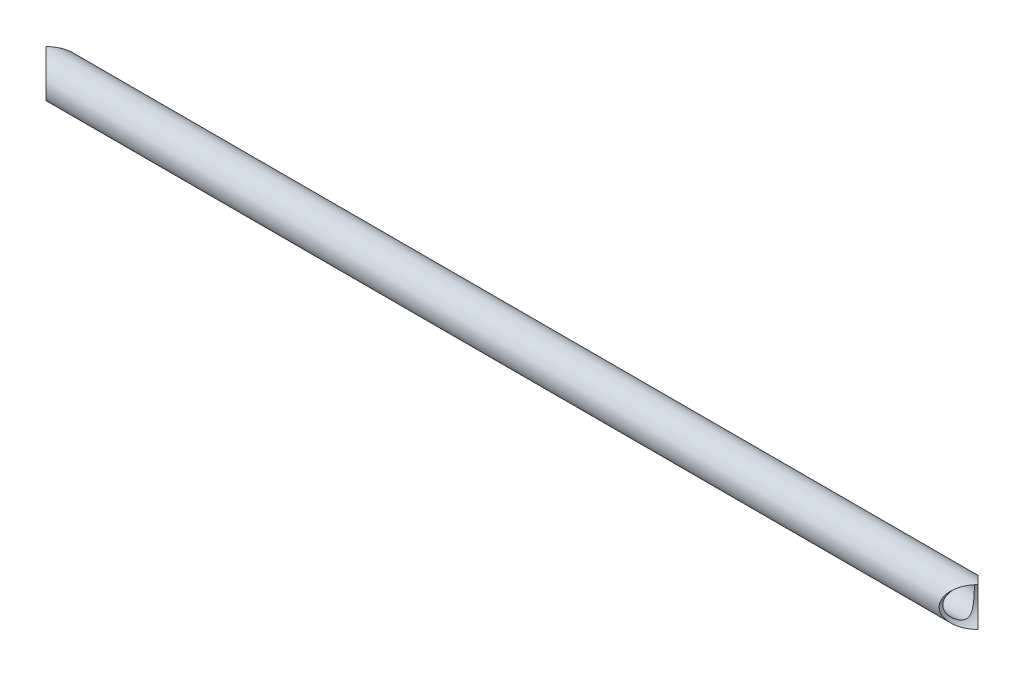
ISO-10303-21;
HEADER;
FILE_DESCRIPTION(('STEP AP214'),'2;1');
FILE_NAME('part.step','',(''),(''),'','','');
FILE_SCHEMA(('AUTOMOTIVE_DESIGN { 1 0 10303 214 1 1 1 1 }'));
ENDSEC;
DATA;
#1=APPLICATION_CONTEXT('core data for automotive mechanical design processes');
#2=APPLICATION_PROTOCOL_DEFINITION('international standard','automotive_design',2000,#1);
#3=PRODUCT_CONTEXT('',#1,'mechanical');
#4=PRODUCT('Part','Part','',(#3));
#5=PRODUCT_RELATED_PRODUCT_CATEGORY('part','',(#4));
#6=PRODUCT_DEFINITION_FORMATION('','',#4);
#7=PRODUCT_DEFINITION_CONTEXT('part definition',#1,'design');
#8=PRODUCT_DEFINITION('design','',#6,#7);
#9=PRODUCT_DEFINITION_SHAPE('','',#8);
#10=(LENGTH_UNIT() NAMED_UNIT(*) SI_UNIT(.MILLI.,.METRE.));
#11=(NAMED_UNIT(*) PLANE_ANGLE_UNIT() SI_UNIT($,.RADIAN.));
#12=(NAMED_UNIT(*) SI_UNIT($,.STERADIAN.) SOLID_ANGLE_UNIT());
#13=UNCERTAINTY_MEASURE_WITH_UNIT(LENGTH_MEASURE(1.E-05),#10,'distance_accuracy_value','');
#14=(GEOMETRIC_REPRESENTATION_CONTEXT(3) GLOBAL_UNCERTAINTY_ASSIGNED_CONTEXT((#13)) GLOBAL_UNIT_ASSIGNED_CONTEXT((#10,
#11,#12)) REPRESENTATION_CONTEXT('',''));
#15=CARTESIAN_POINT('',(0.,0.,0.));
#16=DIRECTION('',(0.,0.,1.));
#17=DIRECTION('',(1.,0.,0.));
#18=AXIS2_PLACEMENT_3D('',#15,#16,#17);
#19=CARTESIAN_POINT('',(473.575059000242,250.,150.));
#20=DIRECTION('',(1.,0.,0.));
#21=DIRECTION('',(0.,0.,-1.));
#22=AXIS2_PLACEMENT_3D('',#19,#20,#21);
#23=CYLINDRICAL_SURFACE('',#22,7.93750000000001);
#24=CARTESIAN_POINT('',(854.389836714472,250.,150.));
#25=DIRECTION('',(0.707106781186547,0.,0.707106781186547));
#26=DIRECTION('',(0.707106781186547,0.,-0.707106781186547));
#27=AXIS2_PLACEMENT_3D('',#24,#25,#26);
#28=ELLIPSE('',#27,11.2253201513364,7.93749999999999);
#29=CARTESIAN_POINT('',(854.389836714472,257.9375,150.));
#30=VERTEX_POINT('',#29);
#31=CARTESIAN_POINT('',(854.389836714472,242.0625,150.));
#32=VERTEX_POINT('',#31);
#33=EDGE_CURVE('E72',#30,#32,#28,.T.);
#34=ORIENTED_EDGE('',*,*,#33,.F.);
#35=CARTESIAN_POINT('',(854.389836714472,250.,150.));
#36=DIRECTION('',(0.707106781186547,0.,-0.707106781186547));
#37=DIRECTION('',(0.707106781186547,0.,0.707106781186547));
#38=AXIS2_PLACEMENT_3D('',#35,#36,#37);
#39=ELLIPSE('',#38,11.2253201513364,7.93749999999999);
#40=EDGE_CURVE('E75',#32,#30,#39,.T.);
#41=ORIENTED_EDGE('',*,*,#40,.F.);
#42=EDGE_LOOP('',(#34,#41));
#43=FACE_BOUND('',#42,.T.);
#44=CARTESIAN_POINT('',(473.575059000242,250.,150.));
#45=DIRECTION('',(0.707106781186547,0.,-0.707106781186547));
#46=DIRECTION('',(0.707106781186547,0.,0.707106781186547));
#47=AXIS2_PLACEMENT_3D('',#44,#45,#46);
#48=ELLIPSE('',#47,11.2253201513364,7.93749999999999);
#49=CARTESIAN_POINT('',(473.575059000242,242.0625,150.));
#50=VERTEX_POINT('',#49);
#51=CARTESIAN_POINT('',(473.575059000242,257.9375,150.));
#52=VERTEX_POINT('',#51);
#53=EDGE_CURVE('E56',#50,#52,#48,.F.);
#54=ORIENTED_EDGE('',*,*,#53,.F.);
#55=CARTESIAN_POINT('',(473.575059000242,250.,150.));
#56=DIRECTION('',(0.707106781186547,0.,0.707106781186547));
#57=DIRECTION('',(0.707106781186547,0.,-0.707106781186547));
#58=AXIS2_PLACEMENT_3D('',#55,#56,#57);
#59=ELLIPSE('',#58,11.2253201513364,7.93749999999999);
#60=EDGE_CURVE('E64',#52,#50,#59,.F.);
#61=ORIENTED_EDGE('',*,*,#60,.F.);
#62=EDGE_LOOP('',(#54,#61));
#63=FACE_BOUND('',#62,.T.);
#64=ADVANCED_FACE('F43',(#43,#63),#23,.T.);
#65=CARTESIAN_POINT('',(854.389836714472,250.,142.0625));
#66=DIRECTION('',(0.,0.,-1.));
#67=DIRECTION('',(-1.,0.,0.));
#68=AXIS2_PLACEMENT_3D('',#65,#66,#67);
#69=CYLINDRICAL_SURFACE('',#68,7.93749999999998);
#70=CARTESIAN_POINT('',(846.452336714472,250.,143.5625));
#71=CARTESIAN_POINT('',(846.452336117175,250.154053503878,143.562499391556));
#72=CARTESIAN_POINT('',(846.456830229221,250.308099275992,143.568038138028));
#73=CARTESIAN_POINT('',(846.474700701227,250.614941540752,143.590092035003));
#74=CARTESIAN_POINT('',(846.488080406953,250.767737540864,143.606611320101));
#75=CARTESIAN_POINT('',(846.523433367951,251.070948446745,143.650356902694));
#76=CARTESIAN_POINT('',(846.545416266588,251.221360482769,143.677595215392));
#77=CARTESIAN_POINT('',(846.597495426092,251.518586125078,143.742328568781));
#78=CARTESIAN_POINT('',(846.627595364868,251.665398067148,143.779828259111));
#79=CARTESIAN_POINT('',(846.695054739684,251.953449267325,143.864218922048));
#80=CARTESIAN_POINT('',(846.732363810036,252.094719448489,143.911044804405));
#81=CARTESIAN_POINT('',(846.813667802221,252.372022320857,144.013614910819));
#82=CARTESIAN_POINT('',(846.857665638709,252.508052696251,144.069363023331));
#83=CARTESIAN_POINT('',(846.998561041187,252.907302010116,144.24899778753));
#84=CARTESIAN_POINT('',(847.104421740357,253.16193206833,144.385350517994));
#85=CARTESIAN_POINT('',(847.296649110361,253.567010929785,144.637618000806));
#86=CARTESIAN_POINT('',(847.378318721496,253.724607397373,144.745978848296));
#87=CARTESIAN_POINT('',(847.547835309607,254.027529423989,144.974429734421));
#88=CARTESIAN_POINT('',(847.635682094035,254.172855365191,145.094519407503));
#89=CARTESIAN_POINT('',(847.815901509588,254.451392250007,145.34577460804));
#90=CARTESIAN_POINT('',(847.908286080737,254.584568272048,145.476970093886));
#91=CARTESIAN_POINT('',(848.095411110484,254.838279289999,145.749457724651));
#92=CARTESIAN_POINT('',(848.190151289637,254.958815776558,145.890748675645));
#93=CARTESIAN_POINT('',(848.38149327293,255.189073760003,146.185491319495));
#94=CARTESIAN_POINT('',(848.478099916573,255.298583011971,146.339105694759));
#95=CARTESIAN_POINT('',(848.669147598739,255.504300509459,146.656372006318));
#96=CARTESIAN_POINT('',(848.76358792488,255.60050443045,146.820027181263));
#97=CARTESIAN_POINT('',(848.946988119906,255.778893983945,147.157106636377));
#98=CARTESIAN_POINT('',(849.035961852143,255.861116098408,147.330503871995));
#99=CARTESIAN_POINT('',(849.204761462203,256.010958511803,147.687581894719));
#100=CARTESIAN_POINT('',(849.284595183679,256.078591375499,147.871253659952));
#101=CARTESIAN_POINT('',(849.439827651853,256.205858825104,148.274067550822));
#102=CARTESIAN_POINT('',(849.513283401976,256.263293117879,148.49470828632));
#103=CARTESIAN_POINT('',(849.60343093173,256.33211340765,148.834206037823));
#104=CARTESIAN_POINT('',(849.630129367316,256.352157205264,148.948713752504));
#105=CARTESIAN_POINT('',(849.675830252699,256.386146122896,149.180122615271));
#106=CARTESIAN_POINT('',(849.694836624946,256.400094351548,149.297022511467));
#107=CARTESIAN_POINT('',(849.724431114293,256.42170078256,149.533705925838));
#108=CARTESIAN_POINT('',(849.734930564402,256.429292760756,149.653506740305));
#109=CARTESIAN_POINT('',(849.746628452573,256.437746269686,149.893799555816));
#110=CARTESIAN_POINT('',(849.747827458794,256.438608211556,150.014291514189));
#111=CARTESIAN_POINT('',(849.740856926651,256.433576824116,150.254924779211));
#112=CARTESIAN_POINT('',(849.732682235175,256.427679779109,150.37506585655));
#113=CARTESIAN_POINT('',(849.707396347862,256.409282210686,150.613889084128));
#114=CARTESIAN_POINT('',(849.690283927915,256.396780782732,150.732571032246));
#115=CARTESIAN_POINT('',(849.645095864901,256.36335068114,150.983507804089));
#116=CARTESIAN_POINT('',(849.615851180716,256.341511467071,151.115429422037));
#117=CARTESIAN_POINT('',(849.548477102424,256.290224863835,151.375526678794));
#118=CARTESIAN_POINT('',(849.51034115642,256.260771862381,151.503699476357));
#119=CARTESIAN_POINT('',(849.426760267409,256.194724969012,151.756089443869));
#120=CARTESIAN_POINT('',(849.381297516467,256.158113631189,151.880296069582));
#121=CARTESIAN_POINT('',(849.284710752249,256.07828298027,152.124229241604));
#122=CARTESIAN_POINT('',(849.233588069839,256.035065219692,152.243956832284));
#123=CARTESIAN_POINT('',(849.099083519325,255.918056943436,152.54069622316));
#124=CARTESIAN_POINT('',(849.012853032199,255.84012539004,152.714792654879));
#125=CARTESIAN_POINT('',(848.834403583464,255.670647289894,153.053026459661));
#126=CARTESIAN_POINT('',(848.742181630023,255.5790939112,153.217158776785));
#127=CARTESIAN_POINT('',(848.554758139937,255.382769650977,153.535853312281));
#128=CARTESIAN_POINT('',(848.459553051637,255.277982526309,153.690403415812));
#129=CARTESIAN_POINT('',(848.268824416687,255.055549816154,153.989683454179));
#130=CARTESIAN_POINT('',(848.173300928949,254.937906493827,154.134415110172));
#131=CARTESIAN_POINT('',(847.980892106524,254.685653023963,154.418523961217));
#132=CARTESIAN_POINT('',(847.884069782061,254.550603956061,154.557555093309));
#133=CARTESIAN_POINT('',(847.694574568538,254.266904551232,154.824191477673));
#134=CARTESIAN_POINT('',(847.601902304611,254.1182521754,154.95179501145));
#135=CARTESIAN_POINT('',(847.423052021173,253.807864625268,155.194253365156));
#136=CARTESIAN_POINT('',(847.336860209571,253.646158847191,155.309135521118));
#137=CARTESIAN_POINT('',(847.172901783939,253.30979203333,155.525086757304));
#138=CARTESIAN_POINT('',(847.095131593489,253.135136550421,155.626161705857));
#139=CARTESIAN_POINT('',(846.970381414778,252.824061773107,155.786848053874));
#140=CARTESIAN_POINT('',(846.920862544258,252.690559949618,155.850162526401));
#141=CARTESIAN_POINT('',(846.828123883391,252.417675878495,155.968109417081));
#142=CARTESIAN_POINT('',(846.78490253826,252.278295093302,156.022743978505));
#143=CARTESIAN_POINT('',(846.705546704803,251.994321060996,156.122640997188));
#144=CARTESIAN_POINT('',(846.669408897112,251.849730293081,156.167907844741));
#145=CARTESIAN_POINT('',(846.60490818532,251.556080853704,156.248455368065));
#146=CARTESIAN_POINT('',(846.576545461402,251.407022078788,156.283735812408));
#147=CARTESIAN_POINT('',(846.528062501365,251.10454086576,156.343919448379));
#148=CARTESIAN_POINT('',(846.507992714356,250.95109761985,156.368759140214));
#149=CARTESIAN_POINT('',(846.476809736582,250.641910788222,156.407310255803));
#150=CARTESIAN_POINT('',(846.46569653795,250.486167204525,156.421021689332));
#151=CARTESIAN_POINT('',(846.452698751369,250.173742475161,156.437055313857));
#152=CARTESIAN_POINT('',(846.450812173613,250.017061538941,156.439379960521));
#153=CARTESIAN_POINT('',(846.456309979651,249.704117727591,156.432600617426));
#154=CARTESIAN_POINT('',(846.463693754049,249.547854825657,156.423497378891));
#155=CARTESIAN_POINT('',(846.486437036525,249.251556716677,156.395411353785));
#156=CARTESIAN_POINT('',(846.500991513167,249.111363064157,156.377425388494));
#157=CARTESIAN_POINT('',(846.537293154282,248.833325557361,156.332465253853));
#158=CARTESIAN_POINT('',(846.559042711397,248.695482500803,156.305488094562));
#159=CARTESIAN_POINT('',(846.609323238679,248.423076226467,156.242934961735));
#160=CARTESIAN_POINT('',(846.637851974912,248.288511944309,156.207361820758));
#161=CARTESIAN_POINT('',(846.701196503383,248.023300674713,156.128070837357));
#162=CARTESIAN_POINT('',(846.736014664127,247.892655184722,156.084349926405));
#163=CARTESIAN_POINT('',(846.852661785326,247.495349160689,155.937190603802));
#164=CARTESIAN_POINT('',(846.94425445961,247.236221002269,155.820741196208));
#165=CARTESIAN_POINT('',(847.147081420434,246.741456744872,155.558945089496));
#166=CARTESIAN_POINT('',(847.258328669965,246.505836311668,155.413579310838));
#167=CARTESIAN_POINT('',(847.462249817372,246.121086306473,155.141466364289));
#168=CARTESIAN_POINT('',(847.551629023476,245.965979718342,155.020576949893));
#169=CARTESIAN_POINT('',(847.735637045691,245.669179061505,154.766917947317));
#170=CARTESIAN_POINT('',(847.830265904414,245.527485101696,154.634148262698));
#171=CARTESIAN_POINT('',(848.022848490047,245.257326528774,154.357288138531));
#172=CARTESIAN_POINT('',(848.120809329027,245.128892926884,154.213172491583));
#173=CARTESIAN_POINT('',(848.317565420569,244.885719152578,153.914413440138));
#174=CARTESIAN_POINT('',(848.416360469619,244.77097573811,153.759772541862));
#175=CARTESIAN_POINT('',(848.597640212907,244.571396110627,153.463897787412));
#176=CARTESIAN_POINT('',(848.680363718146,244.484650519112,153.324094692025));
#177=CARTESIAN_POINT('',(848.842691135114,244.321415264178,153.036837767629));
#178=CARTESIAN_POINT('',(848.922294623768,244.244926988274,152.889382907294));
#179=CARTESIAN_POINT('',(849.075882351539,244.102821757114,152.586990522472));
#180=CARTESIAN_POINT('',(849.149879756936,244.037178873221,152.432072022661));
#181=CARTESIAN_POINT('',(849.289562251927,243.917272604688,152.114397571707));
#182=CARTESIAN_POINT('',(849.355252157132,243.863002615419,151.951646237271));
#183=CARTESIAN_POINT('',(849.491771838547,243.753194194026,151.571047505676));
#184=CARTESIAN_POINT('',(849.558835273736,243.701606343269,151.35059630133));
#185=CARTESIAN_POINT('',(849.638515491533,243.641544526172,151.012218285778));
#186=CARTESIAN_POINT('',(849.661582378451,243.624415527955,150.898210763887));
#187=CARTESIAN_POINT('',(849.699836308458,243.596222100269,150.668161603092));
#188=CARTESIAN_POINT('',(849.715027235875,243.585154681149,150.55212099613));
#189=CARTESIAN_POINT('',(849.736902843023,243.569269073924,150.317819753693));
#190=CARTESIAN_POINT('',(849.743515086158,243.56450409582,150.199548660526));
#191=CARTESIAN_POINT('',(849.747652214957,243.561519092758,149.962766031049));
#192=CARTESIAN_POINT('',(849.745177437482,243.563298825185,149.844254503815));
#193=CARTESIAN_POINT('',(849.731267040817,243.573359614817,149.607960026931));
#194=CARTESIAN_POINT('',(849.719825070421,243.581645279997,149.490177653337));
#195=CARTESIAN_POINT('',(849.688546811481,243.604521088464,149.256310210571));
#196=CARTESIAN_POINT('',(849.668705935939,243.619114676868,149.140226104791));
#197=CARTESIAN_POINT('',(849.616930996133,243.657720293088,148.888173779707));
#198=CARTESIAN_POINT('',(849.583395004987,243.683012459214,148.752731828127));
#199=CARTESIAN_POINT('',(849.507409471479,243.741557392194,148.486076107853));
#200=CARTESIAN_POINT('',(849.464952906018,243.774816434215,148.354865765117));
#201=CARTESIAN_POINT('',(849.372855463585,243.848797011514,148.096799275815));
#202=CARTESIAN_POINT('',(849.32319717628,243.889536696825,147.969954630201));
#203=CARTESIAN_POINT('',(849.218452764175,243.977924407442,147.721086685231));
#204=CARTESIAN_POINT('',(849.163368058877,244.025570627588,147.59906213662));
#205=CARTESIAN_POINT('',(849.019928485145,244.153518387237,147.298375285435));
#206=CARTESIAN_POINT('',(848.92898959641,244.238042179885,147.122732501561));
#207=CARTESIAN_POINT('',(848.741949588296,244.421250233546,146.781861321672));
#208=CARTESIAN_POINT('',(848.645846035772,244.519941206161,146.616637915465));
#209=CARTESIAN_POINT('',(848.451504874175,244.731153472898,146.296285153479));
#210=CARTESIAN_POINT('',(848.353264967858,244.843690329446,146.141167461248));
#211=CARTESIAN_POINT('',(848.157355839532,245.082285014452,145.841373325777));
#212=CARTESIAN_POINT('',(848.059686521188,245.208340486584,145.696695070248));
#213=CARTESIAN_POINT('',(847.864770166767,245.477206001213,145.414739055636));
#214=CARTESIAN_POINT('',(847.767593715729,245.620354111429,145.277733927736));
#215=CARTESIAN_POINT('',(847.578459788172,245.920716836231,145.015972017118));
#216=CARTESIAN_POINT('',(847.48650318347,246.07793378936,144.891217277935));
#217=CARTESIAN_POINT('',(847.310278519823,246.405792922136,144.655493235382));
#218=CARTESIAN_POINT('',(847.225993566814,246.576403981818,144.544493436619));
#219=CARTESIAN_POINT('',(847.067177846831,246.930762706863,144.337559781625));
#220=CARTESIAN_POINT('',(846.992641859928,247.114503260076,144.241617857347));
#221=CARTESIAN_POINT('',(846.876630095035,247.435783870791,144.093462174367));
#222=CARTESIAN_POINT('',(846.832029085518,247.57019373361,144.036865475295));
#223=CARTESIAN_POINT('',(846.749333496696,247.844288584194,143.932396700578));
#224=CARTESIAN_POINT('',(846.711237244745,247.983972204539,143.88452238183));
#225=CARTESIAN_POINT('',(846.642303981088,248.267685451375,143.798190792309));
#226=CARTESIAN_POINT('',(846.611453915345,248.411706726981,143.759716582095));
#227=CARTESIAN_POINT('',(846.557546359713,248.703417420287,143.692649524719));
#228=CARTESIAN_POINT('',(846.534486247306,248.851105585504,143.664053352006));
#229=CARTESIAN_POINT('',(846.494687351236,249.164551319226,143.614773457378));
#230=CARTESIAN_POINT('',(846.478845498381,249.330601884134,143.595209577302));
#231=CARTESIAN_POINT('',(846.457669166133,249.664437735419,143.569071524455));
#232=CARTESIAN_POINT('',(846.452337364977,249.832223453011,143.562500662644));
#233=CARTESIAN_POINT('',(846.452336714472,250.,143.5625));
#234=B_SPLINE_CURVE_WITH_KNOTS('',3,(#70,#71,#72,#73,#74,#75,#76,#77,#78,#79,#80,#81,#82,#83,
#84,#85,#86,#87,#88,#89,#90,#91,#92,#93,#94,#95,#96,#97,#98,#99,#100,#101,#102,#103,#104,#105,
#106,#107,#108,#109,#110,#111,#112,#113,#114,#115,#116,#117,#118,#119,#120,#121,#122,#123,#124,
#125,#126,#127,#128,#129,#130,#131,#132,#133,#134,#135,#136,#137,#138,#139,#140,#141,#142,#143,
#144,#145,#146,#147,#148,#149,#150,#151,#152,#153,#154,#155,#156,#157,#158,#159,#160,#161,#162,
#163,#164,#165,#166,#167,#168,#169,#170,#171,#172,#173,#174,#175,#176,#177,#178,#179,#180,#181,
#182,#183,#184,#185,#186,#187,#188,#189,#190,#191,#192,#193,#194,#195,#196,#197,#198,#199,#200,
#201,#202,#203,#204,#205,#206,#207,#208,#209,#210,#211,#212,#213,#214,#215,#216,#217,#218,#219,
#220,#221,#222,#223,#224,#225,#226,#227,#228,#229,#230,#231,#232,#233),.UNSPECIFIED.,.T.,.F.,(4,
2,2,2,2,2,2,2,2,2,2,2,2,2,2,2,2,2,2,2,2,2,2,2,2,2,2,2,2,2,2,2,2,2,2,2,2,2,2,2,2,2,2,2,2,2,2,2,2,
2,2,2,2,2,2,2,2,2,2,2,2,2,2,2,2,2,2,2,2,2,2,2,2,2,2,2,2,2,2,2,2,4),(0.,0.46198380489352,
0.924141663037799,1.38681904691488,1.84970642754535,2.3094697619533,2.76943401716174,
3.68855815609816,4.31176065043688,4.93494372754667,5.5598649791527,6.18471244733899,
6.81991133646268,7.45531619662533,8.08903680654518,8.72220943601933,9.43812738361897,
9.79559921838154,10.1528885354108,10.5138556034542,10.8748006199652,11.2359441581722,
11.5971371715183,12.0071413632325,12.4174486439692,12.8287686563465,13.2399921562755,
13.8670458475503,14.4944151006164,15.1225620117487,15.7505985237145,16.3998516717726,
17.0492022917972,17.697129323719,18.3447801116173,18.811845634653,19.2787956485428,
19.7455263224608,20.2122678116673,20.6818082883571,21.1513483526329,21.6207871517081,
22.0901950933262,22.5159769206621,22.9419004793907,23.367683878171,23.7936279563192,
24.6854741328244,25.5779107290332,26.2251517033762,26.8723979322329,27.5211250939666,
28.1696983207219,28.7217289303695,29.2738341384586,29.8245996772343,30.3750444757331,
31.0805742266782,31.4329286227947,31.7851090762433,32.1402443178905,32.4953663946207,
32.8507402217215,33.2063083844893,33.6310660160364,34.0561593174992,34.4822979741034,
34.9083254510946,35.5526662184166,36.1973132512347,36.8426915862972,37.4879576126272,
38.149231369111,38.8106152483943,39.4705055253035,40.1300410153286,40.587134920862,
41.0441111107942,41.5002576314258,41.9562504351795,42.4592594650596,42.9623966582976),.UNSPECIFIED.);
#235=CARTESIAN_POINT('',(846.452336714472,250.,143.5625));
#236=VERTEX_POINT('',#235);
#237=EDGE_CURVE('E79',#236,#236,#234,.T.);
#238=ORIENTED_EDGE('',*,*,#237,.F.);
#239=EDGE_LOOP('',(#238));
#240=FACE_BOUND('',#239,.T.);
#241=ORIENTED_EDGE('',*,*,#40,.T.);
#242=ORIENTED_EDGE('',*,*,#33,.T.);
#243=EDGE_LOOP('',(#241,#242));
#244=FACE_BOUND('',#243,.T.);
#245=ADVANCED_FACE('F74',(#240,#244),#69,.F.);
#246=CARTESIAN_POINT('',(473.575059000242,250.,142.0625));
#247=DIRECTION('',(0.,0.,-1.));
#248=DIRECTION('',(-1.,0.,0.));
#249=AXIS2_PLACEMENT_3D('',#246,#247,#248);
#250=CYLINDRICAL_SURFACE('',#249,7.93749999999998);
#251=CARTESIAN_POINT('',(481.512559000242,250.,143.5625));
#252=CARTESIAN_POINT('',(481.512559597539,249.845946496122,143.562499391556));
#253=CARTESIAN_POINT('',(481.508065485493,249.691900724008,143.568038138028));
#254=CARTESIAN_POINT('',(481.490195013487,249.385058459248,143.590092035003));
#255=CARTESIAN_POINT('',(481.476815307761,249.232262459136,143.606611320101));
#256=CARTESIAN_POINT('',(481.441462346763,248.929051553255,143.650356902694));
#257=CARTESIAN_POINT('',(481.419479448126,248.778639517231,143.677595215392));
#258=CARTESIAN_POINT('',(481.367400288622,248.481413874922,143.742328568781));
#259=CARTESIAN_POINT('',(481.337300349846,248.334601932852,143.779828259111));
#260=CARTESIAN_POINT('',(481.26984097503,248.046550732674,143.864218922048));
#261=CARTESIAN_POINT('',(481.232531904678,247.905280551511,143.911044804405));
#262=CARTESIAN_POINT('',(481.151227912492,247.627977679143,144.013614910819));
#263=CARTESIAN_POINT('',(481.107230076005,247.491947303749,144.069363023331));
#264=CARTESIAN_POINT('',(480.966334673527,247.092697989884,144.24899778753));
#265=CARTESIAN_POINT('',(480.860473974357,246.83806793167,144.385350517994));
#266=CARTESIAN_POINT('',(480.668246604353,246.432989070215,144.637618000806));
#267=CARTESIAN_POINT('',(480.586576993218,246.275392602627,144.745978848296));
#268=CARTESIAN_POINT('',(480.417060405107,245.972470576011,144.974429734422));
#269=CARTESIAN_POINT('',(480.329213620679,245.827144634809,145.094519407503));
#270=CARTESIAN_POINT('',(480.148994205126,245.548607749993,145.34577460804));
#271=CARTESIAN_POINT('',(480.056609633977,245.415431727952,145.476970093886));
#272=CARTESIAN_POINT('',(479.86948460423,245.161720710001,145.749457724651));
#273=CARTESIAN_POINT('',(479.774744425076,245.041184223442,145.890748675646));
#274=CARTESIAN_POINT('',(479.583402441784,244.810926239996,146.185491319495));
#275=CARTESIAN_POINT('',(479.486795798141,244.701416988029,146.339105694759));
#276=CARTESIAN_POINT('',(479.295748115975,244.495699490541,146.656372006318));
#277=CARTESIAN_POINT('',(479.201307789834,244.39949556955,146.820027181263));
#278=CARTESIAN_POINT('',(479.017907594808,244.221106016054,147.157106636377));
#279=CARTESIAN_POINT('',(478.92893386257,244.138883901592,147.330503871995));
#280=CARTESIAN_POINT('',(478.760134252511,243.989041488197,147.687581894719));
#281=CARTESIAN_POINT('',(478.680300531035,243.921408624501,147.871253659952));
#282=CARTESIAN_POINT('',(478.525068062861,243.794141174896,148.274067550822));
#283=CARTESIAN_POINT('',(478.451612312738,243.736706882121,148.49470828632));
#284=CARTESIAN_POINT('',(478.361464782984,243.66788659235,148.834206037823));
#285=CARTESIAN_POINT('',(478.334766347398,243.647842794736,148.948713752504));
#286=CARTESIAN_POINT('',(478.289065462015,243.613853877104,149.180122615271));
#287=CARTESIAN_POINT('',(478.270059089767,243.599905648452,149.297022511467));
#288=CARTESIAN_POINT('',(478.240464600421,243.57829921744,149.533705925838));
#289=CARTESIAN_POINT('',(478.229965150311,243.570707239244,149.653506740305));
#290=CARTESIAN_POINT('',(478.218267262142,243.562253730314,149.893799555816));
#291=CARTESIAN_POINT('',(478.21706825592,243.561391788444,150.014291514189));
#292=CARTESIAN_POINT('',(478.224038788063,243.566423175884,150.254924779211));
#293=CARTESIAN_POINT('',(478.232213479539,243.572320220891,150.37506585655));
#294=CARTESIAN_POINT('',(478.257499366852,243.590717789314,150.613889084128));
#295=CARTESIAN_POINT('',(478.274611786799,243.603219217268,150.732571032246));
#296=CARTESIAN_POINT('',(478.319799849813,243.63664931886,150.983507804089));
#297=CARTESIAN_POINT('',(478.349044533998,243.658488532929,151.115429422037));
#298=CARTESIAN_POINT('',(478.41641861229,243.709775136165,151.375526678794));
#299=CARTESIAN_POINT('',(478.454554558294,243.739228137619,151.503699476357));
#300=CARTESIAN_POINT('',(478.538135447305,243.805275030988,151.756089443869));
#301=CARTESIAN_POINT('',(478.583598198247,243.841886368811,151.880296069582));
#302=CARTESIAN_POINT('',(478.680184962465,243.92171701973,152.124229241604));
#303=CARTESIAN_POINT('',(478.731307644875,243.964934780308,152.243956832284));
#304=CARTESIAN_POINT('',(478.865812195389,244.081943056564,152.54069622316));
#305=CARTESIAN_POINT('',(478.952042682515,244.15987460996,152.714792654879));
#306=CARTESIAN_POINT('',(479.13049213125,244.329352710106,153.053026459661));
#307=CARTESIAN_POINT('',(479.222714084691,244.4209060888,153.217158776785));
#308=CARTESIAN_POINT('',(479.410137574777,244.617230349023,153.535853312281));
#309=CARTESIAN_POINT('',(479.505342663077,244.722017473691,153.690403415812));
#310=CARTESIAN_POINT('',(479.696071298027,244.944450183846,153.989683454179));
#311=CARTESIAN_POINT('',(479.791594785765,245.062093506173,154.134415110172));
#312=CARTESIAN_POINT('',(479.984003608189,245.314346976037,154.418523961217));
#313=CARTESIAN_POINT('',(480.080825932653,245.449396043939,154.557555093309));
#314=CARTESIAN_POINT('',(480.270321146176,245.733095448768,154.824191477672));
#315=CARTESIAN_POINT('',(480.362993410103,245.8817478246,154.95179501145));
#316=CARTESIAN_POINT('',(480.541843693541,246.192135374732,155.194253365156));
#317=CARTESIAN_POINT('',(480.628035505143,246.353841152809,155.309135521118));
#318=CARTESIAN_POINT('',(480.791993930775,246.69020796667,155.525086757304));
#319=CARTESIAN_POINT('',(480.869764121225,246.864863449579,155.626161705857));
#320=CARTESIAN_POINT('',(480.994514299936,247.175938226893,155.786848053874));
#321=CARTESIAN_POINT('',(481.044033170456,247.309440050381,155.850162526401));
#322=CARTESIAN_POINT('',(481.136771831323,247.582324121505,155.968109417081));
#323=CARTESIAN_POINT('',(481.179993176454,247.721704906698,156.022743978505));
#324=CARTESIAN_POINT('',(481.259349009911,248.005678939004,156.122640997188));
#325=CARTESIAN_POINT('',(481.295486817602,248.150269706919,156.167907844741));
#326=CARTESIAN_POINT('',(481.359987529394,248.443919146296,156.248455368065));
#327=CARTESIAN_POINT('',(481.388350253312,248.592977921212,156.283735812408));
#328=CARTESIAN_POINT('',(481.436833213349,248.89545913424,156.343919448379));
#329=CARTESIAN_POINT('',(481.456903000358,249.04890238015,156.368759140214));
#330=CARTESIAN_POINT('',(481.488085978132,249.358089211778,156.407310255803));
#331=CARTESIAN_POINT('',(481.499199176764,249.513832795475,156.421021689332));
#332=CARTESIAN_POINT('',(481.512196963345,249.826257524839,156.437055313857));
#333=CARTESIAN_POINT('',(481.514083541101,249.982938461059,156.439379960521));
#334=CARTESIAN_POINT('',(481.508585735062,250.295882272409,156.432600617426));
#335=CARTESIAN_POINT('',(481.501201960665,250.452145174343,156.423497378891));
#336=CARTESIAN_POINT('',(481.478458678189,250.748443283323,156.395411353785));
#337=CARTESIAN_POINT('',(481.463904201547,250.888636935843,156.377425388494));
#338=CARTESIAN_POINT('',(481.427602560432,251.166674442639,156.332465253853));
#339=CARTESIAN_POINT('',(481.405853003318,251.304517499197,156.305488094562));
#340=CARTESIAN_POINT('',(481.355572476035,251.576923773533,156.242934961735));
#341=CARTESIAN_POINT('',(481.327043739802,251.711488055691,156.207361820758));
#342=CARTESIAN_POINT('',(481.263699211331,251.976699325287,156.128070837357));
#343=CARTESIAN_POINT('',(481.228881050587,252.107344815278,156.084349926405));
#344=CARTESIAN_POINT('',(481.112233929388,252.504650839311,155.937190603802));
#345=CARTESIAN_POINT('',(481.020641255103,252.763778997731,155.820741196208));
#346=CARTESIAN_POINT('',(480.817814294279,253.258543255128,155.558945089496));
#347=CARTESIAN_POINT('',(480.706567044749,253.494163688332,155.413579310838));
#348=CARTESIAN_POINT('',(480.502645897342,253.878913693528,155.141466364289));
#349=CARTESIAN_POINT('',(480.413266691238,254.034020281658,155.020576949893));
#350=CARTESIAN_POINT('',(480.229258669023,254.330820938495,154.766917947317));
#351=CARTESIAN_POINT('',(480.134629810299,254.472514898304,154.634148262698));
#352=CARTESIAN_POINT('',(479.942047224667,254.742673471226,154.357288138531));
#353=CARTESIAN_POINT('',(479.844086385687,254.871107073116,154.213172491583));
#354=CARTESIAN_POINT('',(479.647330294145,255.114280847423,153.914413440138));
#355=CARTESIAN_POINT('',(479.548535245095,255.22902426189,153.759772541862));
#356=CARTESIAN_POINT('',(479.367255501807,255.428603889373,153.463897787412));
#357=CARTESIAN_POINT('',(479.284531996568,255.515349480888,153.324094692025));
#358=CARTESIAN_POINT('',(479.1222045796,255.678584735822,153.036837767629));
#359=CARTESIAN_POINT('',(479.042601090946,255.755073011726,152.889382907294));
#360=CARTESIAN_POINT('',(478.889013363175,255.897178242886,152.586990522472));
#361=CARTESIAN_POINT('',(478.815015957777,255.962821126779,152.432072022661));
#362=CARTESIAN_POINT('',(478.675333462787,256.082727395312,152.114397571707));
#363=CARTESIAN_POINT('',(478.609643557582,256.136997384581,151.951646237271));
#364=CARTESIAN_POINT('',(478.473123876167,256.246805805974,151.571047505676));
#365=CARTESIAN_POINT('',(478.406060440978,256.298393656731,151.35059630133));
#366=CARTESIAN_POINT('',(478.326380223181,256.358455473828,151.012218285778));
#367=CARTESIAN_POINT('',(478.303313336263,256.375584472045,150.898210763888));
#368=CARTESIAN_POINT('',(478.265059406256,256.403777899731,150.668161603093));
#369=CARTESIAN_POINT('',(478.249868478839,256.41484531885,150.55212099613));
#370=CARTESIAN_POINT('',(478.227992871691,256.430730926076,150.317819753693));
#371=CARTESIAN_POINT('',(478.221380628556,256.43549590418,150.199548660526));
#372=CARTESIAN_POINT('',(478.217243499757,256.438480907242,149.962766031049));
#373=CARTESIAN_POINT('',(478.219718277232,256.436701174815,149.844254503815));
#374=CARTESIAN_POINT('',(478.233628673897,256.426640385183,149.607960026931));
#375=CARTESIAN_POINT('',(478.245070644293,256.418354720003,149.490177653337));
#376=CARTESIAN_POINT('',(478.276348903233,256.395478911536,149.256310210572));
#377=CARTESIAN_POINT('',(478.296189778775,256.380885323132,149.140226104791));
#378=CARTESIAN_POINT('',(478.347964718581,256.342279706912,148.888173779707));
#379=CARTESIAN_POINT('',(478.381500709727,256.316987540786,148.752731828128));
#380=CARTESIAN_POINT('',(478.457486243235,256.258442607806,148.486076107853));
#381=CARTESIAN_POINT('',(478.499942808696,256.225183565785,148.354865765117));
#382=CARTESIAN_POINT('',(478.592040251129,256.151202988486,148.096799275815));
#383=CARTESIAN_POINT('',(478.641698538434,256.110463303175,147.969954630201));
#384=CARTESIAN_POINT('',(478.746442950539,256.022075592558,147.721086685232));
#385=CARTESIAN_POINT('',(478.801527655836,255.974429372412,147.59906213662));
#386=CARTESIAN_POINT('',(478.944967229569,255.846481612763,147.298375285436));
#387=CARTESIAN_POINT('',(479.035906118304,255.761957820115,147.122732501561));
#388=CARTESIAN_POINT('',(479.222946126418,255.578749766454,146.781861321673));
#389=CARTESIAN_POINT('',(479.319049678942,255.48005879384,146.616637915466));
#390=CARTESIAN_POINT('',(479.513390840538,255.268846527102,146.296285153479));
#391=CARTESIAN_POINT('',(479.611630746855,255.156309670554,146.141167461248));
#392=CARTESIAN_POINT('',(479.807539875182,254.917714985548,145.841373325777));
#393=CARTESIAN_POINT('',(479.905209193526,254.791659513416,145.696695070249));
#394=CARTESIAN_POINT('',(480.100125547946,254.522793998787,145.414739055637));
#395=CARTESIAN_POINT('',(480.197301998985,254.379645888571,145.277733927736));
#396=CARTESIAN_POINT('',(480.386435926542,254.07928316377,145.015972017118));
#397=CARTESIAN_POINT('',(480.478392531244,253.92206621064,144.891217277935));
#398=CARTESIAN_POINT('',(480.654617194891,253.594207077865,144.655493235382));
#399=CARTESIAN_POINT('',(480.7389021479,253.423596018183,144.544493436619));
#400=CARTESIAN_POINT('',(480.897717867883,253.069237293137,144.337559781626));
#401=CARTESIAN_POINT('',(480.972253854786,252.885496739924,144.241617857348));
#402=CARTESIAN_POINT('',(481.088265619679,252.564216129209,144.093462174367));
#403=CARTESIAN_POINT('',(481.132866629196,252.42980626639,144.036865475296));
#404=CARTESIAN_POINT('',(481.215562218018,252.155711415807,143.932396700578));
#405=CARTESIAN_POINT('',(481.253658469969,252.016027795462,143.88452238183));
#406=CARTESIAN_POINT('',(481.322591733626,251.732314548625,143.798190792309));
#407=CARTESIAN_POINT('',(481.353441799369,251.588293273019,143.759716582095));
#408=CARTESIAN_POINT('',(481.407349355001,251.296582579713,143.692649524719));
#409=CARTESIAN_POINT('',(481.430409467408,251.148894414496,143.664053352006));
#410=CARTESIAN_POINT('',(481.470208363478,250.835448680774,143.614773457378));
#411=CARTESIAN_POINT('',(481.486050216332,250.669398115866,143.595209577302));
#412=CARTESIAN_POINT('',(481.507226548581,250.335562264581,143.569071524455));
#413=CARTESIAN_POINT('',(481.512558349738,250.167776546989,143.562500662644));
#414=CARTESIAN_POINT('',(481.512559000242,250.,143.5625));
#415=B_SPLINE_CURVE_WITH_KNOTS('',3,(#251,#252,#253,#254,#255,#256,#257,#258,#259,#260,#261,
#262,#263,#264,#265,#266,#267,#268,#269,#270,#271,#272,#273,#274,#275,#276,#277,#278,#279,#280,
#281,#282,#283,#284,#285,#286,#287,#288,#289,#290,#291,#292,#293,#294,#295,#296,#297,#298,#299,
#300,#301,#302,#303,#304,#305,#306,#307,#308,#309,#310,#311,#312,#313,#314,#315,#316,#317,#318,
#319,#320,#321,#322,#323,#324,#325,#326,#327,#328,#329,#330,#331,#332,#333,#334,#335,#336,#337,
#338,#339,#340,#341,#342,#343,#344,#345,#346,#347,#348,#349,#350,#351,#352,#353,#354,#355,#356,
#357,#358,#359,#360,#361,#362,#363,#364,#365,#366,#367,#368,#369,#370,#371,#372,#373,#374,#375,
#376,#377,#378,#379,#380,#381,#382,#383,#384,#385,#386,#387,#388,#389,#390,#391,#392,#393,#394,
#395,#396,#397,#398,#399,#400,#401,#402,#403,#404,#405,#406,#407,#408,#409,#410,#411,#412,#413,
#414),.UNSPECIFIED.,.T.,.F.,(4,2,2,2,2,2,2,2,2,2,2,2,2,2,2,2,2,2,2,2,2,2,2,2,2,2,2,2,2,2,2,2,2,
2,2,2,2,2,2,2,2,2,2,2,2,2,2,2,2,2,2,2,2,2,2,2,2,2,2,2,2,2,2,2,2,2,2,2,2,2,2,2,2,2,2,2,2,2,2,2,2,
4),(0.,0.461983804893523,0.924141663037825,1.38681904691491,1.84970642754537,2.30946976195324,
2.76943401716175,3.68855815609817,4.31176065043686,4.93494372754676,5.55986497915285,
6.1847124473391,6.81991133646274,7.45531619662536,8.08903680654521,8.72220943601939,
9.43812738361902,9.79559921838153,10.1528885354108,10.5138556034542,10.8748006199652,
11.2359441581722,11.5971371715183,12.0071413632326,12.4174486439692,12.8287686563465,
13.2399921562755,13.8670458475503,14.4944151006164,15.1225620117486,15.7505985237144,
16.3998516717726,17.0492022917972,17.697129323719,18.3447801116173,18.8118456346529,
19.2787956485427,19.7455263224608,20.2122678116673,20.6818082883571,21.1513483526328,
21.620787151708,22.0901950933263,22.5159769206621,22.9419004793907,23.367683878171,
23.7936279563192,24.6854741328244,25.5779107290332,26.2251517033762,26.8723979322329,
27.5211250939666,28.1696983207219,28.7217289303695,29.2738341384586,29.8245996772343,
30.375044475733,31.0805742266781,31.4329286227946,31.7851090762431,32.1402443178904,
32.4953663946205,32.8507402217213,33.2063083844891,33.6310660160361,34.0561593174989,
34.4822979741031,34.9083254510943,35.5526662184163,36.1973132512344,36.8426915862969,
37.4879576126268,38.1492313691106,38.8106152483939,39.4705055253032,40.1300410153282,
40.5871349208617,41.0441111107938,41.5002576314254,41.9562504351791,42.4592594650594,
42.9623966582976),.UNSPECIFIED.);
#416=CARTESIAN_POINT('',(481.512559000242,250.,143.5625));
#417=VERTEX_POINT('',#416);
#418=EDGE_CURVE('E12',#417,#417,#415,.T.);
#419=ORIENTED_EDGE('',*,*,#418,.F.);
#420=EDGE_LOOP('',(#419));
#421=FACE_BOUND('',#420,.T.);
#422=ORIENTED_EDGE('',*,*,#53,.T.);
#423=ORIENTED_EDGE('',*,*,#60,.T.);
#424=EDGE_LOOP('',(#422,#423));
#425=FACE_BOUND('',#424,.T.);
#426=ADVANCED_FACE('F90',(#421,#425),#250,.F.);
#427=CARTESIAN_POINT('',(473.575059000242,250.,150.));
#428=DIRECTION('',(1.,0.,0.));
#429=DIRECTION('',(0.,0.,-1.));
#430=AXIS2_PLACEMENT_3D('',#427,#428,#429);
#431=CYLINDRICAL_SURFACE('',#430,6.43750000000001);
#432=ORIENTED_EDGE('',*,*,#237,.T.);
#433=EDGE_LOOP('',(#432));
#434=FACE_BOUND('',#433,.T.);
#435=ORIENTED_EDGE('',*,*,#418,.T.);
#436=EDGE_LOOP('',(#435));
#437=FACE_BOUND('',#436,.T.);
#438=ADVANCED_FACE('F45',(#434,#437),#431,.F.);
#439=CLOSED_SHELL('',(#64,#245,#426,#438));
#440=MANIFOLD_SOLID_BREP('B2',#439);
#441=ADVANCED_BREP_SHAPE_REPRESENTATION('',(#18,#440),#14);
#442=SHAPE_DEFINITION_REPRESENTATION(#9,#441);
ENDSEC;
END-ISO-10303-21;
